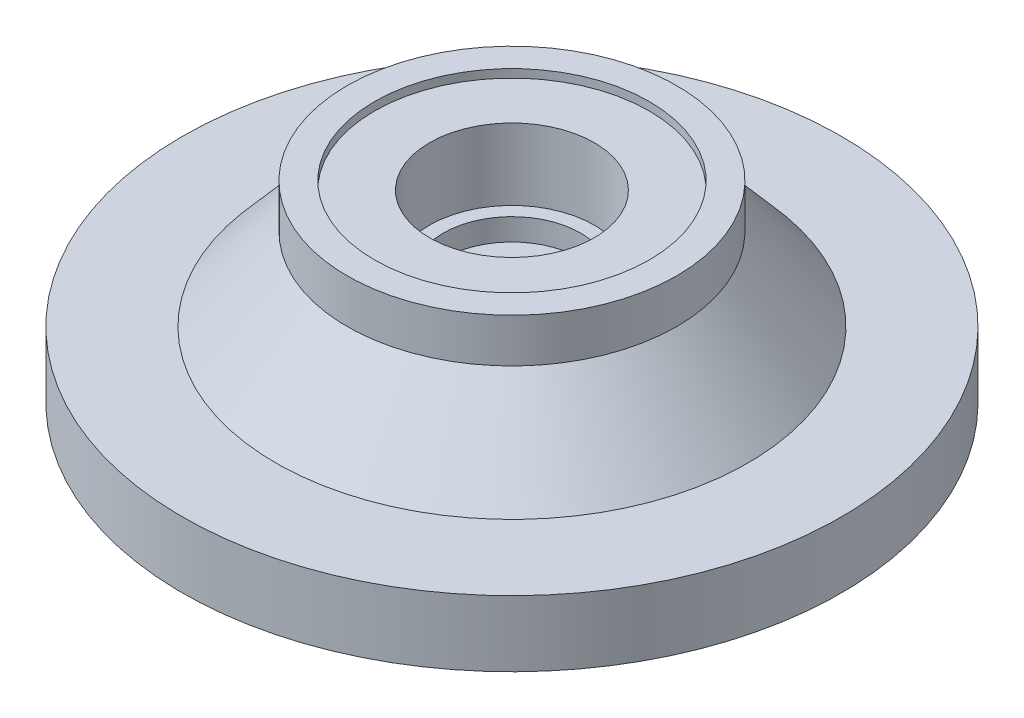
ISO-10303-21;
HEADER;
FILE_DESCRIPTION(('STEP AP214'),'2;1');
FILE_NAME('part.step','',(''),(''),'','','');
FILE_SCHEMA(('AUTOMOTIVE_DESIGN { 1 0 10303 214 1 1 1 1 }'));
ENDSEC;
DATA;
#1=APPLICATION_CONTEXT('core data for automotive mechanical design processes');
#2=APPLICATION_PROTOCOL_DEFINITION('international standard','automotive_design',2000,#1);
#3=PRODUCT_CONTEXT('',#1,'mechanical');
#4=PRODUCT('Part','Part','',(#3));
#5=PRODUCT_RELATED_PRODUCT_CATEGORY('part','',(#4));
#6=PRODUCT_DEFINITION_FORMATION('','',#4);
#7=PRODUCT_DEFINITION_CONTEXT('part definition',#1,'design');
#8=PRODUCT_DEFINITION('design','',#6,#7);
#9=PRODUCT_DEFINITION_SHAPE('','',#8);
#10=(LENGTH_UNIT() NAMED_UNIT(*) SI_UNIT(.MILLI.,.METRE.));
#11=(NAMED_UNIT(*) PLANE_ANGLE_UNIT() SI_UNIT($,.RADIAN.));
#12=(NAMED_UNIT(*) SI_UNIT($,.STERADIAN.) SOLID_ANGLE_UNIT());
#13=UNCERTAINTY_MEASURE_WITH_UNIT(LENGTH_MEASURE(1.E-05),#10,'distance_accuracy_value','');
#14=(GEOMETRIC_REPRESENTATION_CONTEXT(3) GLOBAL_UNCERTAINTY_ASSIGNED_CONTEXT((#13)) GLOBAL_UNIT_ASSIGNED_CONTEXT((#10,
#11,#12)) REPRESENTATION_CONTEXT('',''));
#15=CARTESIAN_POINT('',(0.,0.,0.));
#16=DIRECTION('',(0.,0.,1.));
#17=DIRECTION('',(1.,0.,0.));
#18=AXIS2_PLACEMENT_3D('',#15,#16,#17);
#19=CARTESIAN_POINT('',(0.,0.,0.));
#20=DIRECTION('',(0.,1.,0.));
#21=DIRECTION('',(-1.,0.,0.));
#22=AXIS2_PLACEMENT_3D('',#19,#20,#21);
#23=PLANE('',#22);
#24=CARTESIAN_POINT('',(0.,0.,0.));
#25=DIRECTION('',(0.,-1.,0.));
#26=DIRECTION('',(1.,0.,0.));
#27=AXIS2_PLACEMENT_3D('',#24,#25,#26);
#28=CIRCLE('',#27,43.);
#29=CARTESIAN_POINT('',(43.,0.,0.));
#30=VERTEX_POINT('',#29);
#31=EDGE_CURVE('E110',#30,#30,#28,.T.);
#32=ORIENTED_EDGE('',*,*,#31,.F.);
#33=EDGE_LOOP('',(#32));
#34=FACE_BOUND('',#33,.T.);
#35=CARTESIAN_POINT('',(0.,0.,0.));
#36=DIRECTION('',(0.,1.,0.));
#37=DIRECTION('',(-1.,0.,0.));
#38=AXIS2_PLACEMENT_3D('',#35,#36,#37);
#39=CIRCLE('',#38,60.);
#40=CARTESIAN_POINT('',(-60.,0.,0.));
#41=VERTEX_POINT('',#40);
#42=EDGE_CURVE('E10',#41,#41,#39,.T.);
#43=ORIENTED_EDGE('',*,*,#42,.F.);
#44=EDGE_LOOP('',(#43));
#45=FACE_BOUND('',#44,.T.);
#46=ADVANCED_FACE('F45',(#34,#45),#23,.F.);
#47=CARTESIAN_POINT('',(0.,35.,0.));
#48=DIRECTION('',(0.,1.,0.));
#49=DIRECTION('',(-1.,0.,0.));
#50=AXIS2_PLACEMENT_3D('',#47,#48,#49);
#51=CYLINDRICAL_SURFACE('',#50,60.);
#52=CARTESIAN_POINT('',(0.,12.,0.));
#53=DIRECTION('',(0.,1.,0.));
#54=DIRECTION('',(-1.,0.,0.));
#55=AXIS2_PLACEMENT_3D('',#52,#53,#54);
#56=CIRCLE('',#55,60.);
#57=CARTESIAN_POINT('',(-60.,12.,0.));
#58=VERTEX_POINT('',#57);
#59=EDGE_CURVE('E53',#58,#58,#56,.T.);
#60=ORIENTED_EDGE('',*,*,#59,.F.);
#61=EDGE_LOOP('',(#60));
#62=FACE_BOUND('',#61,.T.);
#63=ORIENTED_EDGE('',*,*,#42,.T.);
#64=EDGE_LOOP('',(#63));
#65=FACE_BOUND('',#64,.T.);
#66=ADVANCED_FACE('F130',(#62,#65),#51,.T.);
#67=CARTESIAN_POINT('',(60.,12.,0.));
#68=DIRECTION('',(0.,-1.,0.));
#69=DIRECTION('',(1.,0.,0.));
#70=AXIS2_PLACEMENT_3D('',#67,#68,#69);
#71=PLANE('',#70);
#72=CARTESIAN_POINT('',(0.,12.,0.));
#73=DIRECTION('',(0.,1.,0.));
#74=DIRECTION('',(-1.,0.,0.));
#75=AXIS2_PLACEMENT_3D('',#72,#73,#74);
#76=CIRCLE('',#75,43.);
#77=CARTESIAN_POINT('',(-43.,12.,0.));
#78=VERTEX_POINT('',#77);
#79=EDGE_CURVE('E59',#78,#78,#76,.T.);
#80=ORIENTED_EDGE('',*,*,#79,.F.);
#81=EDGE_LOOP('',(#80));
#82=FACE_BOUND('',#81,.T.);
#83=ORIENTED_EDGE('',*,*,#59,.T.);
#84=EDGE_LOOP('',(#83));
#85=FACE_BOUND('',#84,.T.);
#86=ADVANCED_FACE('F127',(#82,#85),#71,.F.);
#87=CARTESIAN_POINT('',(0.,12.,0.));
#88=DIRECTION('',(0.,-1.,0.));
#89=DIRECTION('',(1.,0.,0.));
#90=AXIS2_PLACEMENT_3D('',#87,#88,#89);
#91=CONICAL_SURFACE('',#90,43.,0.714090698612157);
#92=CARTESIAN_POINT('',(0.,27.,0.));
#93=DIRECTION('',(0.,1.,0.));
#94=DIRECTION('',(-1.,0.,0.));
#95=AXIS2_PLACEMENT_3D('',#92,#93,#94);
#96=CIRCLE('',#95,30.);
#97=CARTESIAN_POINT('',(-30.,27.,0.));
#98=VERTEX_POINT('',#97);
#99=EDGE_CURVE('E118',#98,#98,#96,.T.);
#100=ORIENTED_EDGE('',*,*,#99,.F.);
#101=EDGE_LOOP('',(#100));
#102=FACE_BOUND('',#101,.T.);
#103=ORIENTED_EDGE('',*,*,#79,.T.);
#104=EDGE_LOOP('',(#103));
#105=FACE_BOUND('',#104,.T.);
#106=ADVANCED_FACE('F125',(#102,#105),#91,.T.);
#107=CARTESIAN_POINT('',(0.,35.,0.));
#108=DIRECTION('',(0.,1.,0.));
#109=DIRECTION('',(-1.,0.,0.));
#110=AXIS2_PLACEMENT_3D('',#107,#108,#109);
#111=CYLINDRICAL_SURFACE('',#110,30.);
#112=CARTESIAN_POINT('',(0.,35.,0.));
#113=DIRECTION('',(0.,1.,0.));
#114=DIRECTION('',(-1.,0.,0.));
#115=AXIS2_PLACEMENT_3D('',#112,#113,#114);
#116=CIRCLE('',#115,30.);
#117=CARTESIAN_POINT('',(-30.,35.,0.));
#118=VERTEX_POINT('',#117);
#119=EDGE_CURVE('E114',#118,#118,#116,.T.);
#120=ORIENTED_EDGE('',*,*,#119,.F.);
#121=EDGE_LOOP('',(#120));
#122=FACE_BOUND('',#121,.T.);
#123=ORIENTED_EDGE('',*,*,#99,.T.);
#124=EDGE_LOOP('',(#123));
#125=FACE_BOUND('',#124,.T.);
#126=ADVANCED_FACE('F142',(#122,#125),#111,.T.);
#127=CARTESIAN_POINT('',(30.,35.,0.));
#128=DIRECTION('',(0.,-1.,0.));
#129=DIRECTION('',(1.,0.,0.));
#130=AXIS2_PLACEMENT_3D('',#127,#128,#129);
#131=PLANE('',#130);
#132=CARTESIAN_POINT('',(0.,35.,0.));
#133=DIRECTION('',(0.,1.,0.));
#134=DIRECTION('',(-1.,0.,0.));
#135=AXIS2_PLACEMENT_3D('',#132,#133,#134);
#136=CIRCLE('',#135,25.);
#137=CARTESIAN_POINT('',(-25.,35.,0.));
#138=VERTEX_POINT('',#137);
#139=EDGE_CURVE('E85',#138,#138,#136,.T.);
#140=ORIENTED_EDGE('',*,*,#139,.F.);
#141=EDGE_LOOP('',(#140));
#142=FACE_BOUND('',#141,.T.);
#143=ORIENTED_EDGE('',*,*,#119,.T.);
#144=EDGE_LOOP('',(#143));
#145=FACE_BOUND('',#144,.T.);
#146=ADVANCED_FACE('F146',(#142,#145),#131,.F.);
#147=CARTESIAN_POINT('',(0.,2.,0.));
#148=DIRECTION('',(0.,-1.,0.));
#149=DIRECTION('',(0.,0.,-1.));
#150=AXIS2_PLACEMENT_3D('',#147,#148,#149);
#151=CONICAL_SURFACE('',#150,40.,0.982793723247328);
#152=ORIENTED_EDGE('',*,*,#31,.T.);
#153=EDGE_LOOP('',(#152));
#154=FACE_BOUND('',#153,.T.);
#155=CARTESIAN_POINT('',(0.,2.,0.));
#156=DIRECTION('',(0.,-1.,0.));
#157=DIRECTION('',(0.,0.,-1.));
#158=AXIS2_PLACEMENT_3D('',#155,#156,#157);
#159=CIRCLE('',#158,40.);
#160=CARTESIAN_POINT('',(0.,2.,-40.));
#161=VERTEX_POINT('',#160);
#162=EDGE_CURVE('E106',#161,#161,#159,.T.);
#163=ORIENTED_EDGE('',*,*,#162,.F.);
#164=EDGE_LOOP('',(#163));
#165=FACE_BOUND('',#164,.T.);
#166=ADVANCED_FACE('F150',(#154,#165),#151,.F.);
#167=CARTESIAN_POINT('',(0.,5.,0.));
#168=DIRECTION('',(0.,-1.,0.));
#169=DIRECTION('',(1.,0.,0.));
#170=AXIS2_PLACEMENT_3D('',#167,#168,#169);
#171=CYLINDRICAL_SURFACE('',#170,40.);
#172=CARTESIAN_POINT('',(0.,5.,0.));
#173=DIRECTION('',(0.,-1.,0.));
#174=DIRECTION('',(0.,0.,-1.));
#175=AXIS2_PLACEMENT_3D('',#172,#173,#174);
#176=CIRCLE('',#175,40.);
#177=CARTESIAN_POINT('',(0.,5.,-40.));
#178=VERTEX_POINT('',#177);
#179=EDGE_CURVE('E99',#178,#178,#176,.T.);
#180=ORIENTED_EDGE('',*,*,#179,.F.);
#181=EDGE_LOOP('',(#180));
#182=FACE_BOUND('',#181,.T.);
#183=ORIENTED_EDGE('',*,*,#162,.T.);
#184=EDGE_LOOP('',(#183));
#185=FACE_BOUND('',#184,.T.);
#186=ADVANCED_FACE('F152',(#182,#185),#171,.F.);
#187=CARTESIAN_POINT('',(0.,13.5,0.));
#188=DIRECTION('',(0.,-1.,0.));
#189=DIRECTION('',(0.,0.,-1.));
#190=AXIS2_PLACEMENT_3D('',#187,#188,#189);
#191=CONICAL_SURFACE('',#190,30.,0.866302262552679);
#192=ORIENTED_EDGE('',*,*,#179,.T.);
#193=EDGE_LOOP('',(#192));
#194=FACE_BOUND('',#193,.T.);
#195=CARTESIAN_POINT('',(0.,13.5,0.));
#196=DIRECTION('',(0.,-1.,0.));
#197=DIRECTION('',(1.,0.,0.));
#198=AXIS2_PLACEMENT_3D('',#195,#196,#197);
#199=CIRCLE('',#198,30.);
#200=CARTESIAN_POINT('',(30.,13.5,0.));
#201=VERTEX_POINT('',#200);
#202=EDGE_CURVE('E91',#201,#201,#199,.T.);
#203=ORIENTED_EDGE('',*,*,#202,.F.);
#204=EDGE_LOOP('',(#203));
#205=FACE_BOUND('',#204,.T.);
#206=ADVANCED_FACE('F155',(#194,#205),#191,.F.);
#207=CARTESIAN_POINT('',(0.,14.5,0.));
#208=DIRECTION('',(0.,-1.,0.));
#209=DIRECTION('',(1.,0.,0.));
#210=AXIS2_PLACEMENT_3D('',#207,#208,#209);
#211=CYLINDRICAL_SURFACE('',#210,30.);
#212=CARTESIAN_POINT('',(0.,14.5,0.));
#213=DIRECTION('',(0.,-1.,0.));
#214=DIRECTION('',(1.,0.,0.));
#215=AXIS2_PLACEMENT_3D('',#212,#213,#214);
#216=CIRCLE('',#215,30.);
#217=CARTESIAN_POINT('',(30.,14.5,0.));
#218=VERTEX_POINT('',#217);
#219=EDGE_CURVE('E95',#218,#218,#216,.T.);
#220=ORIENTED_EDGE('',*,*,#219,.F.);
#221=EDGE_LOOP('',(#220));
#222=FACE_BOUND('',#221,.T.);
#223=ORIENTED_EDGE('',*,*,#202,.T.);
#224=EDGE_LOOP('',(#223));
#225=FACE_BOUND('',#224,.T.);
#226=ADVANCED_FACE('F162',(#222,#225),#211,.F.);
#227=CARTESIAN_POINT('',(0.,14.5,0.));
#228=DIRECTION('',(0.,-1.,0.));
#229=DIRECTION('',(1.,0.,0.));
#230=AXIS2_PLACEMENT_3D('',#227,#228,#229);
#231=PLANE('',#230);
#232=CARTESIAN_POINT('',(0.,14.5,0.));
#233=DIRECTION('',(0.,-1.,0.));
#234=DIRECTION('',(1.,0.,0.));
#235=AXIS2_PLACEMENT_3D('',#232,#233,#234);
#236=CIRCLE('',#235,9.);
#237=CARTESIAN_POINT('',(-9.,14.5,0.));
#238=VERTEX_POINT('',#237);
#239=EDGE_CURVE('E75',#238,#238,#236,.T.);
#240=ORIENTED_EDGE('',*,*,#239,.F.);
#241=EDGE_LOOP('',(#240));
#242=FACE_BOUND('',#241,.T.);
#243=ORIENTED_EDGE('',*,*,#219,.T.);
#244=EDGE_LOOP('',(#243));
#245=FACE_BOUND('',#244,.T.);
#246=ADVANCED_FACE('F166',(#242,#245),#231,.T.);
#247=CARTESIAN_POINT('',(0.,33.5,0.));
#248=DIRECTION('',(0.,1.,0.));
#249=DIRECTION('',(-1.,0.,0.));
#250=AXIS2_PLACEMENT_3D('',#247,#248,#249);
#251=CYLINDRICAL_SURFACE('',#250,25.);
#252=CARTESIAN_POINT('',(0.,33.5,0.));
#253=DIRECTION('',(0.,1.,0.));
#254=DIRECTION('',(-1.,0.,0.));
#255=AXIS2_PLACEMENT_3D('',#252,#253,#254);
#256=CIRCLE('',#255,25.);
#257=CARTESIAN_POINT('',(-25.,33.5,0.));
#258=VERTEX_POINT('',#257);
#259=EDGE_CURVE('E87',#258,#258,#256,.T.);
#260=ORIENTED_EDGE('',*,*,#259,.F.);
#261=EDGE_LOOP('',(#260));
#262=FACE_BOUND('',#261,.T.);
#263=ORIENTED_EDGE('',*,*,#139,.T.);
#264=EDGE_LOOP('',(#263));
#265=FACE_BOUND('',#264,.T.);
#266=ADVANCED_FACE('F170',(#262,#265),#251,.F.);
#267=CARTESIAN_POINT('',(0.,33.5,0.));
#268=DIRECTION('',(0.,1.,0.));
#269=DIRECTION('',(-1.,0.,0.));
#270=AXIS2_PLACEMENT_3D('',#267,#268,#269);
#271=PLANE('',#270);
#272=CARTESIAN_POINT('',(0.,33.5,0.));
#273=DIRECTION('',(0.,1.,0.));
#274=DIRECTION('',(-1.,0.,0.));
#275=AXIS2_PLACEMENT_3D('',#272,#273,#274);
#276=CIRCLE('',#275,15.);
#277=CARTESIAN_POINT('',(-15.,33.5,0.));
#278=VERTEX_POINT('',#277);
#279=EDGE_CURVE('E65',#278,#278,#276,.T.);
#280=ORIENTED_EDGE('',*,*,#279,.F.);
#281=EDGE_LOOP('',(#280));
#282=FACE_BOUND('',#281,.T.);
#283=ORIENTED_EDGE('',*,*,#259,.T.);
#284=EDGE_LOOP('',(#283));
#285=FACE_BOUND('',#284,.T.);
#286=ADVANCED_FACE('F174',(#282,#285),#271,.T.);
#287=CARTESIAN_POINT('',(0.,20.5,0.));
#288=DIRECTION('',(0.,1.,0.));
#289=DIRECTION('',(-1.,0.,0.));
#290=AXIS2_PLACEMENT_3D('',#287,#288,#289);
#291=CYLINDRICAL_SURFACE('',#290,15.);
#292=CARTESIAN_POINT('',(0.,20.5,0.));
#293=DIRECTION('',(0.,1.,0.));
#294=DIRECTION('',(-1.,0.,0.));
#295=AXIS2_PLACEMENT_3D('',#292,#293,#294);
#296=CIRCLE('',#295,15.);
#297=CARTESIAN_POINT('',(-15.,20.5,0.));
#298=VERTEX_POINT('',#297);
#299=EDGE_CURVE('E72',#298,#298,#296,.T.);
#300=CARTESIAN_POINT('',(-15.,20.5,0.));
#301=CARTESIAN_POINT('',(-15.,20.6354166666667,0.));
#302=CARTESIAN_POINT('',(-15.,20.7708333333333,0.));
#303=CARTESIAN_POINT('',(-15.,21.0416666666667,0.));
#304=CARTESIAN_POINT('',(-15.,21.1770833333333,0.));
#305=CARTESIAN_POINT('',(-15.,21.4479166666667,0.));
#306=CARTESIAN_POINT('',(-15.,21.5833333333333,0.));
#307=CARTESIAN_POINT('',(-15.,21.8541666666667,0.));
#308=CARTESIAN_POINT('',(-15.,21.9895833333333,0.));
#309=CARTESIAN_POINT('',(-15.,22.2604166666667,0.));
#310=CARTESIAN_POINT('',(-15.,22.3958333333333,0.));
#311=CARTESIAN_POINT('',(-15.,22.6666666666667,0.));
#312=CARTESIAN_POINT('',(-15.,22.8020833333333,0.));
#313=CARTESIAN_POINT('',(-15.,23.0729166666667,0.));
#314=CARTESIAN_POINT('',(-15.,23.2083333333333,0.));
#315=CARTESIAN_POINT('',(-15.,23.4791666666667,0.));
#316=CARTESIAN_POINT('',(-15.,23.6145833333333,0.));
#317=CARTESIAN_POINT('',(-15.,23.8854166666667,0.));
#318=CARTESIAN_POINT('',(-15.,24.0208333333333,0.));
#319=CARTESIAN_POINT('',(-15.,24.2916666666667,0.));
#320=CARTESIAN_POINT('',(-15.,24.4270833333333,0.));
#321=CARTESIAN_POINT('',(-15.,24.6979166666667,0.));
#322=CARTESIAN_POINT('',(-15.,24.8333333333333,0.));
#323=CARTESIAN_POINT('',(-15.,25.1041666666667,0.));
#324=CARTESIAN_POINT('',(-15.,25.2395833333333,0.));
#325=CARTESIAN_POINT('',(-15.,25.5104166666667,0.));
#326=CARTESIAN_POINT('',(-15.,25.6458333333333,0.));
#327=CARTESIAN_POINT('',(-15.,25.9166666666667,0.));
#328=CARTESIAN_POINT('',(-15.,26.0520833333333,0.));
#329=CARTESIAN_POINT('',(-15.,26.3229166666667,0.));
#330=CARTESIAN_POINT('',(-15.,26.4583333333333,0.));
#331=CARTESIAN_POINT('',(-15.,26.7291666666667,0.));
#332=CARTESIAN_POINT('',(-15.,26.8645833333333,0.));
#333=CARTESIAN_POINT('',(-15.,27.1354166666667,0.));
#334=CARTESIAN_POINT('',(-15.,27.2708333333333,0.));
#335=CARTESIAN_POINT('',(-15.,27.5416666666667,0.));
#336=CARTESIAN_POINT('',(-15.,27.6770833333333,0.));
#337=CARTESIAN_POINT('',(-15.,27.9479166666667,0.));
#338=CARTESIAN_POINT('',(-15.,28.0833333333333,0.));
#339=CARTESIAN_POINT('',(-15.,28.3541666666667,0.));
#340=CARTESIAN_POINT('',(-15.,28.4895833333333,0.));
#341=CARTESIAN_POINT('',(-15.,28.7604166666667,0.));
#342=CARTESIAN_POINT('',(-15.,28.8958333333333,0.));
#343=CARTESIAN_POINT('',(-15.,29.1666666666667,0.));
#344=CARTESIAN_POINT('',(-15.,29.3020833333333,0.));
#345=CARTESIAN_POINT('',(-15.,29.5729166666667,0.));
#346=CARTESIAN_POINT('',(-15.,29.7083333333333,0.));
#347=CARTESIAN_POINT('',(-15.,29.9791666666667,0.));
#348=CARTESIAN_POINT('',(-15.,30.1145833333333,0.));
#349=CARTESIAN_POINT('',(-15.,30.3854166666667,0.));
#350=CARTESIAN_POINT('',(-15.,30.5208333333333,0.));
#351=CARTESIAN_POINT('',(-15.,30.7916666666667,0.));
#352=CARTESIAN_POINT('',(-15.,30.9270833333333,0.));
#353=CARTESIAN_POINT('',(-15.,31.1979166666667,0.));
#354=CARTESIAN_POINT('',(-15.,31.3333333333333,0.));
#355=CARTESIAN_POINT('',(-15.,31.6041666666667,0.));
#356=CARTESIAN_POINT('',(-15.,31.7395833333333,0.));
#357=CARTESIAN_POINT('',(-15.,32.0104166666667,0.));
#358=CARTESIAN_POINT('',(-15.,32.1458333333333,0.));
#359=CARTESIAN_POINT('',(-15.,32.4166666666667,0.));
#360=CARTESIAN_POINT('',(-15.,32.5520833333333,0.));
#361=CARTESIAN_POINT('',(-15.,32.8229166666667,0.));
#362=CARTESIAN_POINT('',(-15.,32.9583333333333,0.));
#363=CARTESIAN_POINT('',(-15.,33.2291666666667,0.));
#364=CARTESIAN_POINT('',(-15.,33.3645833333333,0.));
#365=CARTESIAN_POINT('',(-15.,33.5,0.));
#366=B_SPLINE_CURVE_WITH_KNOTS('',3,(#300,#301,#302,#303,#304,#305,#306,#307,#308,#309,#310,
#311,#312,#313,#314,#315,#316,#317,#318,#319,#320,#321,#322,#323,#324,#325,#326,#327,#328,#329,
#330,#331,#332,#333,#334,#335,#336,#337,#338,#339,#340,#341,#342,#343,#344,#345,#346,#347,#348,
#349,#350,#351,#352,#353,#354,#355,#356,#357,#358,#359,#360,#361,#362,#363,#364,#365),
.UNSPECIFIED.,.F.,.F.,(4,2,2,2,2,2,2,2,2,2,2,2,2,2,2,2,2,2,2,2,2,2,2,2,2,2,2,2,2,2,2,2,4),(0.,
0.40625,0.812500000000001,1.21875,1.625,2.03125,2.4375,2.84375,3.25,3.65625,4.0625,4.46875,
4.875,5.28125,5.6875,6.09375,6.5,6.90625,7.3125,7.71875,8.125,8.53125,8.9375,9.34375,9.75,
10.15625,10.5625,10.96875,11.375,11.78125,12.1875,12.59375,13.),.UNSPECIFIED.);
#367=EDGE_CURVE('BSEAM178',#298,#278,#366,.T.);
#368=ORIENTED_EDGE('',*,*,#299,.F.);
#369=ORIENTED_EDGE('',*,*,#279,.T.);
#370=ORIENTED_EDGE('',*,*,#367,.T.);
#371=ORIENTED_EDGE('',*,*,#367,.F.);
#372=EDGE_LOOP('',(#368,#370,#369,#371));
#373=FACE_BOUND('',#372,.T.);
#374=ADVANCED_FACE('F178',(#373),#291,.F.);
#375=CARTESIAN_POINT('',(0.,20.5,0.));
#376=DIRECTION('',(0.,1.,0.));
#377=DIRECTION('',(-1.,0.,0.));
#378=AXIS2_PLACEMENT_3D('',#375,#376,#377);
#379=PLANE('',#378);
#380=CARTESIAN_POINT('',(0.,20.5,0.));
#381=DIRECTION('',(0.,1.,0.));
#382=DIRECTION('',(-1.,0.,0.));
#383=AXIS2_PLACEMENT_3D('',#380,#381,#382);
#384=CIRCLE('',#383,12.5);
#385=CARTESIAN_POINT('',(-12.5,20.5,0.));
#386=VERTEX_POINT('',#385);
#387=EDGE_CURVE('E62',#386,#386,#384,.T.);
#388=ORIENTED_EDGE('',*,*,#387,.F.);
#389=EDGE_LOOP('',(#388));
#390=FACE_BOUND('',#389,.T.);
#391=ORIENTED_EDGE('',*,*,#299,.T.);
#392=EDGE_LOOP('',(#391));
#393=FACE_BOUND('',#392,.T.);
#394=ADVANCED_FACE('F182',(#390,#393),#379,.T.);
#395=CARTESIAN_POINT('',(0.,16.5,0.));
#396=DIRECTION('',(0.,1.,0.));
#397=DIRECTION('',(-1.,0.,0.));
#398=AXIS2_PLACEMENT_3D('',#395,#396,#397);
#399=CYLINDRICAL_SURFACE('',#398,12.5);
#400=ORIENTED_EDGE('',*,*,#387,.T.);
#401=EDGE_LOOP('',(#400));
#402=FACE_BOUND('',#401,.T.);
#403=CARTESIAN_POINT('',(0.,16.5,0.));
#404=DIRECTION('',(0.,1.,0.));
#405=DIRECTION('',(-1.,0.,0.));
#406=AXIS2_PLACEMENT_3D('',#403,#404,#405);
#407=CIRCLE('',#406,12.5);
#408=CARTESIAN_POINT('',(-12.5,16.5,0.));
#409=VERTEX_POINT('',#408);
#410=EDGE_CURVE('E66',#409,#409,#407,.T.);
#411=ORIENTED_EDGE('',*,*,#410,.F.);
#412=EDGE_LOOP('',(#411));
#413=FACE_BOUND('',#412,.T.);
#414=ADVANCED_FACE('F186',(#402,#413),#399,.F.);
#415=CARTESIAN_POINT('',(0.,16.5,0.));
#416=DIRECTION('',(0.,1.,0.));
#417=DIRECTION('',(-1.,0.,0.));
#418=AXIS2_PLACEMENT_3D('',#415,#416,#417);
#419=PLANE('',#418);
#420=CARTESIAN_POINT('',(0.,16.5,0.));
#421=DIRECTION('',(0.,1.,0.));
#422=DIRECTION('',(-1.,0.,0.));
#423=AXIS2_PLACEMENT_3D('',#420,#421,#422);
#424=CIRCLE('',#423,9.);
#425=CARTESIAN_POINT('',(-9.,16.5,0.));
#426=VERTEX_POINT('',#425);
#427=EDGE_CURVE('E48',#426,#426,#424,.T.);
#428=ORIENTED_EDGE('',*,*,#427,.F.);
#429=EDGE_LOOP('',(#428));
#430=FACE_BOUND('',#429,.T.);
#431=ORIENTED_EDGE('',*,*,#410,.T.);
#432=EDGE_LOOP('',(#431));
#433=FACE_BOUND('',#432,.T.);
#434=ADVANCED_FACE('F190',(#430,#433),#419,.T.);
#435=CARTESIAN_POINT('',(0.,12.5,0.));
#436=DIRECTION('',(0.,1.,0.));
#437=DIRECTION('',(-1.,0.,0.));
#438=AXIS2_PLACEMENT_3D('',#435,#436,#437);
#439=CYLINDRICAL_SURFACE('',#438,9.);
#440=CARTESIAN_POINT('',(-9.,14.5,0.));
#441=CARTESIAN_POINT('',(-9.,14.5208333333333,0.));
#442=CARTESIAN_POINT('',(-9.,14.5416666666667,0.));
#443=CARTESIAN_POINT('',(-9.,14.5833333333333,0.));
#444=CARTESIAN_POINT('',(-9.,14.6041666666667,0.));
#445=CARTESIAN_POINT('',(-9.,14.6458333333333,0.));
#446=CARTESIAN_POINT('',(-9.,14.6666666666667,0.));
#447=CARTESIAN_POINT('',(-9.,14.7083333333333,0.));
#448=CARTESIAN_POINT('',(-9.,14.7291666666667,0.));
#449=CARTESIAN_POINT('',(-9.,14.7708333333333,0.));
#450=CARTESIAN_POINT('',(-9.,14.7916666666667,0.));
#451=CARTESIAN_POINT('',(-9.,14.8333333333333,0.));
#452=CARTESIAN_POINT('',(-9.,14.8541666666667,0.));
#453=CARTESIAN_POINT('',(-9.,14.8958333333333,0.));
#454=CARTESIAN_POINT('',(-9.,14.9166666666667,0.));
#455=CARTESIAN_POINT('',(-9.,14.9583333333333,0.));
#456=CARTESIAN_POINT('',(-9.,14.9791666666667,0.));
#457=CARTESIAN_POINT('',(-9.,15.0208333333333,0.));
#458=CARTESIAN_POINT('',(-9.,15.0416666666667,0.));
#459=CARTESIAN_POINT('',(-9.,15.0833333333333,0.));
#460=CARTESIAN_POINT('',(-9.,15.1041666666667,0.));
#461=CARTESIAN_POINT('',(-9.,15.1458333333333,0.));
#462=CARTESIAN_POINT('',(-9.,15.1666666666667,0.));
#463=CARTESIAN_POINT('',(-9.,15.2083333333333,0.));
#464=CARTESIAN_POINT('',(-9.,15.2291666666667,0.));
#465=CARTESIAN_POINT('',(-9.,15.2708333333333,0.));
#466=CARTESIAN_POINT('',(-9.,15.2916666666667,0.));
#467=CARTESIAN_POINT('',(-9.,15.3333333333333,0.));
#468=CARTESIAN_POINT('',(-9.,15.3541666666667,0.));
#469=CARTESIAN_POINT('',(-9.,15.3958333333333,0.));
#470=CARTESIAN_POINT('',(-9.,15.4166666666667,0.));
#471=CARTESIAN_POINT('',(-9.,15.4583333333333,0.));
#472=CARTESIAN_POINT('',(-9.,15.4791666666667,0.));
#473=CARTESIAN_POINT('',(-9.,15.5208333333333,0.));
#474=CARTESIAN_POINT('',(-9.,15.5416666666667,0.));
#475=CARTESIAN_POINT('',(-9.,15.5833333333333,0.));
#476=CARTESIAN_POINT('',(-9.,15.6041666666667,0.));
#477=CARTESIAN_POINT('',(-9.,15.6458333333333,0.));
#478=CARTESIAN_POINT('',(-9.,15.6666666666667,0.));
#479=CARTESIAN_POINT('',(-9.,15.7083333333333,0.));
#480=CARTESIAN_POINT('',(-9.,15.7291666666667,0.));
#481=CARTESIAN_POINT('',(-9.,15.7708333333333,0.));
#482=CARTESIAN_POINT('',(-9.,15.7916666666667,0.));
#483=CARTESIAN_POINT('',(-9.,15.8333333333333,0.));
#484=CARTESIAN_POINT('',(-9.,15.8541666666667,0.));
#485=CARTESIAN_POINT('',(-9.,15.8958333333333,0.));
#486=CARTESIAN_POINT('',(-9.,15.9166666666667,0.));
#487=CARTESIAN_POINT('',(-9.,15.9583333333333,0.));
#488=CARTESIAN_POINT('',(-9.,15.9791666666667,0.));
#489=CARTESIAN_POINT('',(-9.,16.0208333333333,0.));
#490=CARTESIAN_POINT('',(-9.,16.0416666666667,0.));
#491=CARTESIAN_POINT('',(-9.,16.0833333333333,0.));
#492=CARTESIAN_POINT('',(-9.,16.1041666666667,0.));
#493=CARTESIAN_POINT('',(-9.,16.1458333333333,0.));
#494=CARTESIAN_POINT('',(-9.,16.1666666666667,0.));
#495=CARTESIAN_POINT('',(-9.,16.2083333333333,0.));
#496=CARTESIAN_POINT('',(-9.,16.2291666666667,0.));
#497=CARTESIAN_POINT('',(-9.,16.2708333333333,0.));
#498=CARTESIAN_POINT('',(-9.,16.2916666666667,0.));
#499=CARTESIAN_POINT('',(-9.,16.3333333333333,0.));
#500=CARTESIAN_POINT('',(-9.,16.3541666666667,0.));
#501=CARTESIAN_POINT('',(-9.,16.3958333333333,0.));
#502=CARTESIAN_POINT('',(-9.,16.4166666666667,0.));
#503=CARTESIAN_POINT('',(-9.,16.4583333333333,0.));
#504=CARTESIAN_POINT('',(-9.,16.4791666666667,0.));
#505=CARTESIAN_POINT('',(-9.,16.5,0.));
#506=B_SPLINE_CURVE_WITH_KNOTS('',3,(#440,#441,#442,#443,#444,#445,#446,#447,#448,#449,#450,
#451,#452,#453,#454,#455,#456,#457,#458,#459,#460,#461,#462,#463,#464,#465,#466,#467,#468,#469,
#470,#471,#472,#473,#474,#475,#476,#477,#478,#479,#480,#481,#482,#483,#484,#485,#486,#487,#488,
#489,#490,#491,#492,#493,#494,#495,#496,#497,#498,#499,#500,#501,#502,#503,#504,#505),
.UNSPECIFIED.,.F.,.F.,(4,2,2,2,2,2,2,2,2,2,2,2,2,2,2,2,2,2,2,2,2,2,2,2,2,2,2,2,2,2,2,2,4),(0.,
0.0625000000000001,0.125,0.1875,0.25,0.3125,0.375,0.4375,0.5,0.5625,0.625000000000001,
0.687500000000001,0.750000000000001,0.812500000000001,0.875000000000001,0.937500000000001,1.,
1.0625,1.125,1.1875,1.25,1.3125,1.375,1.4375,1.5,1.5625,1.625,1.6875,1.75,1.8125,1.875,1.9375,
2.),.UNSPECIFIED.);
#507=EDGE_CURVE('BSEAM193',#238,#426,#506,.T.);
#508=ORIENTED_EDGE('',*,*,#239,.T.);
#509=ORIENTED_EDGE('',*,*,#427,.T.);
#510=ORIENTED_EDGE('',*,*,#507,.T.);
#511=ORIENTED_EDGE('',*,*,#507,.F.);
#512=EDGE_LOOP('',(#508,#510,#509,#511));
#513=FACE_BOUND('',#512,.T.);
#514=ADVANCED_FACE('F193',(#513),#439,.F.);
#515=CLOSED_SHELL('',(#46,#66,#86,#106,#126,#146,#166,#186,#206,#226,#246,#266,#286,#374,#394,
#414,#434,#514));
#516=MANIFOLD_SOLID_BREP('B2',#515);
#517=ADVANCED_BREP_SHAPE_REPRESENTATION('',(#18,#516),#14);
#518=SHAPE_DEFINITION_REPRESENTATION(#9,#517);
ENDSEC;
END-ISO-10303-21;
